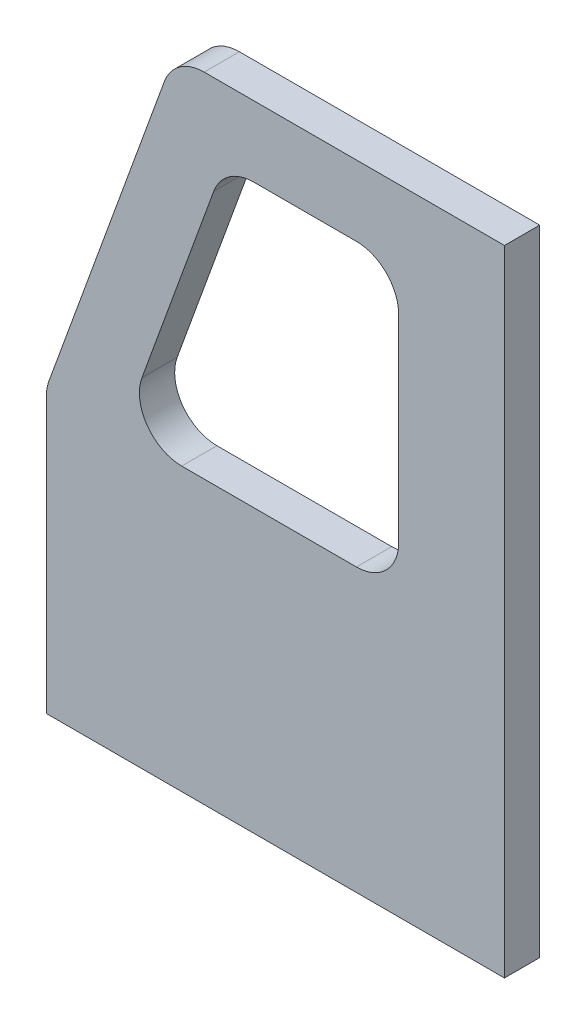
ISO-10303-21;
HEADER;
FILE_DESCRIPTION(('STEP AP214'),'2;1');
FILE_NAME('part.step','',(''),(''),'','','');
FILE_SCHEMA(('AUTOMOTIVE_DESIGN { 1 0 10303 214 1 1 1 1 }'));
ENDSEC;
DATA;
#1=APPLICATION_CONTEXT('core data for automotive mechanical design processes');
#2=APPLICATION_PROTOCOL_DEFINITION('international standard','automotive_design',2000,#1);
#3=PRODUCT_CONTEXT('',#1,'mechanical');
#4=PRODUCT('Part','Part','',(#3));
#5=PRODUCT_RELATED_PRODUCT_CATEGORY('part','',(#4));
#6=PRODUCT_DEFINITION_FORMATION('','',#4);
#7=PRODUCT_DEFINITION_CONTEXT('part definition',#1,'design');
#8=PRODUCT_DEFINITION('design','',#6,#7);
#9=PRODUCT_DEFINITION_SHAPE('','',#8);
#10=(LENGTH_UNIT() NAMED_UNIT(*) SI_UNIT(.MILLI.,.METRE.));
#11=(NAMED_UNIT(*) PLANE_ANGLE_UNIT() SI_UNIT($,.RADIAN.));
#12=(NAMED_UNIT(*) SI_UNIT($,.STERADIAN.) SOLID_ANGLE_UNIT());
#13=UNCERTAINTY_MEASURE_WITH_UNIT(LENGTH_MEASURE(1.E-05),#10,'distance_accuracy_value','');
#14=(GEOMETRIC_REPRESENTATION_CONTEXT(3) GLOBAL_UNCERTAINTY_ASSIGNED_CONTEXT((#13)) GLOBAL_UNIT_ASSIGNED_CONTEXT((#10,
#11,#12)) REPRESENTATION_CONTEXT('',''));
#15=CARTESIAN_POINT('',(0.,0.,0.));
#16=DIRECTION('',(0.,0.,1.));
#17=DIRECTION('',(1.,0.,0.));
#18=AXIS2_PLACEMENT_3D('',#15,#16,#17);
#19=CARTESIAN_POINT('',(0.,40.,5.));
#20=DIRECTION('',(1.,0.,0.));
#21=DIRECTION('',(0.,1.,0.));
#22=AXIS2_PLACEMENT_3D('',#19,#20,#21);
#23=PLANE('',#22);
#24=DIRECTION('',(0.,-1.,0.));
#25=VECTOR('',#24,1.);
#26=CARTESIAN_POINT('',(0.,40.,5.));
#27=LINE('',#26,#25);
#28=CARTESIAN_POINT('',(0.,38.9420381157492,5.));
#29=VERTEX_POINT('',#28);
#30=CARTESIAN_POINT('',(0.,0.,5.));
#31=VERTEX_POINT('',#30);
#32=EDGE_CURVE('E138',#29,#31,#27,.T.);
#33=ORIENTED_EDGE('',*,*,#32,.F.);
#34=DIRECTION('',(0.,0.,-1.));
#35=VECTOR('',#34,1.);
#36=CARTESIAN_POINT('',(0.,38.9420381157492,5.));
#37=LINE('',#36,#35);
#38=CARTESIAN_POINT('',(0.,38.9420381157492,0.));
#39=VERTEX_POINT('',#38);
#40=EDGE_CURVE('E181',#29,#39,#37,.T.);
#41=ORIENTED_EDGE('',*,*,#40,.T.);
#42=DIRECTION('',(0.,-1.,0.));
#43=VECTOR('',#42,1.);
#44=CARTESIAN_POINT('',(0.,40.,0.));
#45=LINE('',#44,#43);
#46=CARTESIAN_POINT('',(0.,0.,0.));
#47=VERTEX_POINT('',#46);
#48=EDGE_CURVE('E160',#39,#47,#45,.T.);
#49=ORIENTED_EDGE('',*,*,#48,.T.);
#50=DIRECTION('',(0.,0.,-1.));
#51=VECTOR('',#50,1.);
#52=CARTESIAN_POINT('',(0.,0.,5.));
#53=LINE('',#52,#51);
#54=EDGE_CURVE('E153',#31,#47,#53,.T.);
#55=ORIENTED_EDGE('',*,*,#54,.F.);
#56=EDGE_LOOP('',(#33,#41,#49,#55));
#57=FACE_BOUND('',#56,.T.);
#58=ADVANCED_FACE('F33',(#57),#23,.F.);
#59=CARTESIAN_POINT('',(0.,0.,5.));
#60=DIRECTION('',(0.,1.,0.));
#61=DIRECTION('',(0.,0.,1.));
#62=AXIS2_PLACEMENT_3D('',#59,#60,#61);
#63=PLANE('',#62);
#64=DIRECTION('',(1.,0.,0.));
#65=VECTOR('',#64,1.);
#66=CARTESIAN_POINT('',(0.,0.,0.));
#67=LINE('',#66,#65);
#68=CARTESIAN_POINT('',(65.,0.,0.));
#69=VERTEX_POINT('',#68);
#70=EDGE_CURVE('E261',#47,#69,#67,.T.);
#71=ORIENTED_EDGE('',*,*,#70,.T.);
#72=DIRECTION('',(0.,0.,-1.));
#73=VECTOR('',#72,1.);
#74=CARTESIAN_POINT('',(65.,0.,5.));
#75=LINE('',#74,#73);
#76=CARTESIAN_POINT('',(65.,0.,5.));
#77=VERTEX_POINT('',#76);
#78=EDGE_CURVE('E155',#77,#69,#75,.T.);
#79=ORIENTED_EDGE('',*,*,#78,.F.);
#80=DIRECTION('',(1.,0.,0.));
#81=VECTOR('',#80,1.);
#82=CARTESIAN_POINT('',(0.,0.,5.));
#83=LINE('',#82,#81);
#84=EDGE_CURVE('E142',#31,#77,#83,.T.);
#85=ORIENTED_EDGE('',*,*,#84,.F.);
#86=ORIENTED_EDGE('',*,*,#54,.T.);
#87=EDGE_LOOP('',(#71,#79,#85,#86));
#88=FACE_BOUND('',#87,.T.);
#89=ADVANCED_FACE('F152',(#88),#63,.F.);
#90=CARTESIAN_POINT('',(65.,0.,5.));
#91=DIRECTION('',(-1.,0.,0.));
#92=DIRECTION('',(0.,0.,1.));
#93=AXIS2_PLACEMENT_3D('',#90,#91,#92);
#94=PLANE('',#93);
#95=DIRECTION('',(0.,1.,0.));
#96=VECTOR('',#95,1.);
#97=CARTESIAN_POINT('',(65.,0.,0.));
#98=LINE('',#97,#96);
#99=CARTESIAN_POINT('',(65.,90.,0.));
#100=VERTEX_POINT('',#99);
#101=EDGE_CURVE('E263',#69,#100,#98,.T.);
#102=ORIENTED_EDGE('',*,*,#101,.T.);
#103=DIRECTION('',(0.,0.,-1.));
#104=VECTOR('',#103,1.);
#105=CARTESIAN_POINT('',(65.,90.,5.));
#106=LINE('',#105,#104);
#107=CARTESIAN_POINT('',(65.,90.,5.));
#108=VERTEX_POINT('',#107);
#109=EDGE_CURVE('E166',#108,#100,#106,.T.);
#110=ORIENTED_EDGE('',*,*,#109,.F.);
#111=DIRECTION('',(0.,1.,0.));
#112=VECTOR('',#111,1.);
#113=CARTESIAN_POINT('',(65.,0.,5.));
#114=LINE('',#113,#112);
#115=EDGE_CURVE('E157',#77,#108,#114,.T.);
#116=ORIENTED_EDGE('',*,*,#115,.F.);
#117=ORIENTED_EDGE('',*,*,#78,.T.);
#118=EDGE_LOOP('',(#102,#110,#116,#117));
#119=FACE_BOUND('',#118,.T.);
#120=ADVANCED_FACE('F289',(#119),#94,.F.);
#121=CARTESIAN_POINT('',(65.,90.,5.));
#122=DIRECTION('',(0.,-1.,0.));
#123=DIRECTION('',(0.,0.,-1.));
#124=AXIS2_PLACEMENT_3D('',#121,#122,#123);
#125=PLANE('',#124);
#126=DIRECTION('',(-1.,0.,0.));
#127=VECTOR('',#126,1.);
#128=CARTESIAN_POINT('',(65.,90.,0.));
#129=LINE('',#128,#127);
#130=CARTESIAN_POINT('',(22.3997569425684,90.,0.));
#131=VERTEX_POINT('',#130);
#132=EDGE_CURVE('E265',#100,#131,#129,.T.);
#133=ORIENTED_EDGE('',*,*,#132,.T.);
#134=DIRECTION('',(0.,0.,-1.));
#135=VECTOR('',#134,1.);
#136=CARTESIAN_POINT('',(22.3997569425684,90.,5.));
#137=LINE('',#136,#135);
#138=CARTESIAN_POINT('',(22.3997569425684,90.,5.));
#139=VERTEX_POINT('',#138);
#140=EDGE_CURVE('E176',#131,#139,#137,.F.);
#141=ORIENTED_EDGE('',*,*,#140,.T.);
#142=DIRECTION('',(-1.,0.,0.));
#143=VECTOR('',#142,1.);
#144=CARTESIAN_POINT('',(65.,90.,5.));
#145=LINE('',#144,#143);
#146=EDGE_CURVE('E256',#108,#139,#145,.T.);
#147=ORIENTED_EDGE('',*,*,#146,.F.);
#148=ORIENTED_EDGE('',*,*,#109,.T.);
#149=EDGE_LOOP('',(#133,#141,#147,#148));
#150=FACE_BOUND('',#149,.T.);
#151=ADVANCED_FACE('F274',(#150),#125,.F.);
#152=CARTESIAN_POINT('',(18.1985117133102,90.,5.));
#153=DIRECTION('',(0.939692620785908,-0.34202014332567,0.));
#154=DIRECTION('',(0.34202014332567,0.939692620785908,0.));
#155=AXIS2_PLACEMENT_3D('',#152,#153,#154);
#156=PLANE('',#155);
#157=DIRECTION('',(-0.34202014332567,-0.939692620785908,0.));
#158=VECTOR('',#157,1.);
#159=CARTESIAN_POINT('',(18.1985117133102,90.,5.));
#160=LINE('',#159,#158);
#161=CARTESIAN_POINT('',(16.761601217853,86.052120859954,5.));
#162=VERTEX_POINT('',#161);
#163=CARTESIAN_POINT('',(0.361844275284552,40.9941589757032,5.));
#164=VERTEX_POINT('',#163);
#165=EDGE_CURVE('E258',#162,#164,#160,.T.);
#166=ORIENTED_EDGE('',*,*,#165,.F.);
#167=DIRECTION('',(0.,0.,-1.));
#168=VECTOR('',#167,1.);
#169=CARTESIAN_POINT('',(16.761601217853,86.052120859954,5.));
#170=LINE('',#169,#168);
#171=CARTESIAN_POINT('',(16.761601217853,86.052120859954,0.));
#172=VERTEX_POINT('',#171);
#173=EDGE_CURVE('E164',#162,#172,#170,.T.);
#174=ORIENTED_EDGE('',*,*,#173,.T.);
#175=DIRECTION('',(-0.34202014332567,-0.939692620785908,0.));
#176=VECTOR('',#175,1.);
#177=CARTESIAN_POINT('',(18.1985117133102,90.,0.));
#178=LINE('',#177,#176);
#179=CARTESIAN_POINT('',(0.361844275284552,40.9941589757032,0.));
#180=VERTEX_POINT('',#179);
#181=EDGE_CURVE('E148',#172,#180,#178,.T.);
#182=ORIENTED_EDGE('',*,*,#181,.T.);
#183=DIRECTION('',(0.,0.,-1.));
#184=VECTOR('',#183,1.);
#185=CARTESIAN_POINT('',(0.361844275284552,40.9941589757032,5.));
#186=LINE('',#185,#184);
#187=EDGE_CURVE('E162',#180,#164,#186,.F.);
#188=ORIENTED_EDGE('',*,*,#187,.T.);
#189=EDGE_LOOP('',(#166,#174,#182,#188));
#190=FACE_BOUND('',#189,.T.);
#191=ADVANCED_FACE('F285',(#190),#156,.F.);
#192=CARTESIAN_POINT('',(0.,0.,5.));
#193=DIRECTION('',(0.,0.,1.));
#194=DIRECTION('',(1.,0.,0.));
#195=AXIS2_PLACEMENT_3D('',#192,#193,#194);
#196=PLANE('',#195);
#197=DIRECTION('',(1.,0.,0.));
#198=VECTOR('',#197,1.);
#199=CARTESIAN_POINT('',(0.,40.,5.));
#200=LINE('',#199,#198);
#201=CARTESIAN_POINT('',(19.2106657652118,40.,5.));
#202=VERTEX_POINT('',#201);
#203=CARTESIAN_POINT('',(44.,40.,5.));
#204=VERTEX_POINT('',#203);
#205=EDGE_CURVE('E218',#202,#204,#200,.T.);
#206=ORIENTED_EDGE('',*,*,#205,.F.);
#207=CARTESIAN_POINT('',(19.2106657652118,46.,5.));
#208=DIRECTION('',(0.,0.,1.));
#209=DIRECTION('',(1.,0.,0.));
#210=AXIS2_PLACEMENT_3D('',#207,#208,#209);
#211=CIRCLE('',#210,6.);
#212=CARTESIAN_POINT('',(13.5725100404964,48.052120859954,5.));
#213=VERTEX_POINT('',#212);
#214=EDGE_CURVE('E41',#202,#213,#211,.F.);
#215=ORIENTED_EDGE('',*,*,#214,.T.);
#216=DIRECTION('',(-0.34202014332567,-0.939692620785908,0.));
#217=VECTOR('',#216,1.);
#218=CARTESIAN_POINT('',(-3.45882598587175,1.25890970436377,5.));
#219=LINE('',#218,#217);
#220=CARTESIAN_POINT('',(23.7636765999501,76.052120859954,5.));
#221=VERTEX_POINT('',#220);
#222=EDGE_CURVE('E216',#221,#213,#219,.T.);
#223=ORIENTED_EDGE('',*,*,#222,.F.);
#224=CARTESIAN_POINT('',(29.4018323246655,74.,5.));
#225=DIRECTION('',(0.,0.,1.));
#226=DIRECTION('',(1.,0.,0.));
#227=AXIS2_PLACEMENT_3D('',#224,#225,#226);
#228=CIRCLE('',#227,6.);
#229=CARTESIAN_POINT('',(29.4018323246655,80.,5.));
#230=VERTEX_POINT('',#229);
#231=EDGE_CURVE('E203',#221,#230,#228,.F.);
#232=ORIENTED_EDGE('',*,*,#231,.T.);
#233=DIRECTION('',(-1.,0.,0.));
#234=VECTOR('',#233,1.);
#235=CARTESIAN_POINT('',(0.,80.,5.));
#236=LINE('',#235,#234);
#237=CARTESIAN_POINT('',(44.,80.,5.));
#238=VERTEX_POINT('',#237);
#239=EDGE_CURVE('E227',#238,#230,#236,.T.);
#240=ORIENTED_EDGE('',*,*,#239,.F.);
#241=CARTESIAN_POINT('',(44.,74.,5.));
#242=DIRECTION('',(0.,0.,1.));
#243=DIRECTION('',(1.,0.,0.));
#244=AXIS2_PLACEMENT_3D('',#241,#242,#243);
#245=CIRCLE('',#244,6.);
#246=CARTESIAN_POINT('',(50.,74.,5.));
#247=VERTEX_POINT('',#246);
#248=EDGE_CURVE('E56',#238,#247,#245,.F.);
#249=ORIENTED_EDGE('',*,*,#248,.T.);
#250=DIRECTION('',(0.,1.,0.));
#251=VECTOR('',#250,1.);
#252=CARTESIAN_POINT('',(50.,0.,5.));
#253=LINE('',#252,#251);
#254=CARTESIAN_POINT('',(50.,46.,5.));
#255=VERTEX_POINT('',#254);
#256=EDGE_CURVE('E250',#255,#247,#253,.T.);
#257=ORIENTED_EDGE('',*,*,#256,.F.);
#258=CARTESIAN_POINT('',(44.,46.,5.));
#259=DIRECTION('',(0.,0.,1.));
#260=DIRECTION('',(1.,0.,0.));
#261=AXIS2_PLACEMENT_3D('',#258,#259,#260);
#262=CIRCLE('',#261,6.);
#263=EDGE_CURVE('E210',#255,#204,#262,.F.);
#264=ORIENTED_EDGE('',*,*,#263,.T.);
#265=EDGE_LOOP('',(#206,#215,#223,#232,#240,#249,#257,#264));
#266=FACE_BOUND('',#265,.T.);
#267=ORIENTED_EDGE('',*,*,#146,.T.);
#268=CARTESIAN_POINT('',(22.3997569425684,84.,5.));
#269=DIRECTION('',(0.,0.,1.));
#270=DIRECTION('',(1.,0.,0.));
#271=AXIS2_PLACEMENT_3D('',#268,#269,#270);
#272=CIRCLE('',#271,6.);
#273=EDGE_CURVE('E179',#139,#162,#272,.T.);
#274=ORIENTED_EDGE('',*,*,#273,.T.);
#275=ORIENTED_EDGE('',*,*,#165,.T.);
#276=CARTESIAN_POINT('',(6.,38.9420381157492,5.));
#277=DIRECTION('',(0.,0.,1.));
#278=DIRECTION('',(1.,0.,0.));
#279=AXIS2_PLACEMENT_3D('',#276,#277,#278);
#280=CIRCLE('',#279,6.);
#281=EDGE_CURVE('E48',#164,#29,#280,.T.);
#282=ORIENTED_EDGE('',*,*,#281,.T.);
#283=ORIENTED_EDGE('',*,*,#32,.T.);
#284=ORIENTED_EDGE('',*,*,#84,.T.);
#285=ORIENTED_EDGE('',*,*,#115,.T.);
#286=EDGE_LOOP('',(#267,#274,#275,#282,#283,#284,#285));
#287=FACE_BOUND('',#286,.T.);
#288=ADVANCED_FACE('F141',(#266,#287),#196,.T.);
#289=CARTESIAN_POINT('',(0.,0.,0.));
#290=DIRECTION('',(0.,0.,1.));
#291=DIRECTION('',(1.,0.,0.));
#292=AXIS2_PLACEMENT_3D('',#289,#290,#291);
#293=PLANE('',#292);
#294=DIRECTION('',(-1.,0.,0.));
#295=VECTOR('',#294,1.);
#296=CARTESIAN_POINT('',(25.2005870954072,80.,0.));
#297=LINE('',#296,#295);
#298=CARTESIAN_POINT('',(44.,80.,0.));
#299=VERTEX_POINT('',#298);
#300=CARTESIAN_POINT('',(29.4018323246655,80.,0.));
#301=VERTEX_POINT('',#300);
#302=EDGE_CURVE('E245',#299,#301,#297,.T.);
#303=ORIENTED_EDGE('',*,*,#302,.T.);
#304=CARTESIAN_POINT('',(29.4018323246655,74.,0.));
#305=DIRECTION('',(0.,0.,1.));
#306=DIRECTION('',(1.,0.,0.));
#307=AXIS2_PLACEMENT_3D('',#304,#305,#306);
#308=CIRCLE('',#307,6.);
#309=CARTESIAN_POINT('',(23.76367659995,76.052120859954,0.));
#310=VERTEX_POINT('',#309);
#311=EDGE_CURVE('E205',#301,#310,#308,.T.);
#312=ORIENTED_EDGE('',*,*,#311,.T.);
#313=DIRECTION('',(-0.34202014332567,-0.939692620785908,0.));
#314=VECTOR('',#313,1.);
#315=CARTESIAN_POINT('',(10.6417777247591,40.,0.));
#316=LINE('',#315,#314);
#317=CARTESIAN_POINT('',(13.5725100404964,48.052120859954,0.));
#318=VERTEX_POINT('',#317);
#319=EDGE_CURVE('E238',#310,#318,#316,.T.);
#320=ORIENTED_EDGE('',*,*,#319,.T.);
#321=CARTESIAN_POINT('',(19.2106657652118,46.,0.));
#322=DIRECTION('',(0.,0.,1.));
#323=DIRECTION('',(1.,0.,0.));
#324=AXIS2_PLACEMENT_3D('',#321,#322,#323);
#325=CIRCLE('',#324,6.);
#326=CARTESIAN_POINT('',(19.2106657652118,40.,0.));
#327=VERTEX_POINT('',#326);
#328=EDGE_CURVE('E11',#318,#327,#325,.T.);
#329=ORIENTED_EDGE('',*,*,#328,.T.);
#330=DIRECTION('',(1.,0.,0.));
#331=VECTOR('',#330,1.);
#332=CARTESIAN_POINT('',(50.,40.,0.));
#333=LINE('',#332,#331);
#334=CARTESIAN_POINT('',(44.,40.,0.));
#335=VERTEX_POINT('',#334);
#336=EDGE_CURVE('E236',#327,#335,#333,.T.);
#337=ORIENTED_EDGE('',*,*,#336,.T.);
#338=CARTESIAN_POINT('',(44.,46.,0.));
#339=DIRECTION('',(0.,0.,1.));
#340=DIRECTION('',(1.,0.,0.));
#341=AXIS2_PLACEMENT_3D('',#338,#339,#340);
#342=CIRCLE('',#341,6.);
#343=CARTESIAN_POINT('',(50.,46.,0.));
#344=VERTEX_POINT('',#343);
#345=EDGE_CURVE('E212',#335,#344,#342,.T.);
#346=ORIENTED_EDGE('',*,*,#345,.T.);
#347=DIRECTION('',(0.,1.,0.));
#348=VECTOR('',#347,1.);
#349=CARTESIAN_POINT('',(50.,80.,0.));
#350=LINE('',#349,#348);
#351=CARTESIAN_POINT('',(50.,74.,0.));
#352=VERTEX_POINT('',#351);
#353=EDGE_CURVE('E242',#344,#352,#350,.T.);
#354=ORIENTED_EDGE('',*,*,#353,.T.);
#355=CARTESIAN_POINT('',(44.,74.,0.));
#356=DIRECTION('',(0.,0.,1.));
#357=DIRECTION('',(1.,0.,0.));
#358=AXIS2_PLACEMENT_3D('',#355,#356,#357);
#359=CIRCLE('',#358,6.);
#360=EDGE_CURVE('E208',#352,#299,#359,.T.);
#361=ORIENTED_EDGE('',*,*,#360,.T.);
#362=EDGE_LOOP('',(#303,#312,#320,#329,#337,#346,#354,#361));
#363=FACE_BOUND('',#362,.T.);
#364=ORIENTED_EDGE('',*,*,#181,.F.);
#365=CARTESIAN_POINT('',(22.3997569425684,84.,0.));
#366=DIRECTION('',(0.,0.,1.));
#367=DIRECTION('',(1.,0.,0.));
#368=AXIS2_PLACEMENT_3D('',#365,#366,#367);
#369=CIRCLE('',#368,6.);
#370=EDGE_CURVE('E174',#172,#131,#369,.F.);
#371=ORIENTED_EDGE('',*,*,#370,.T.);
#372=ORIENTED_EDGE('',*,*,#132,.F.);
#373=ORIENTED_EDGE('',*,*,#101,.F.);
#374=ORIENTED_EDGE('',*,*,#70,.F.);
#375=ORIENTED_EDGE('',*,*,#48,.F.);
#376=CARTESIAN_POINT('',(6.,38.9420381157492,0.));
#377=DIRECTION('',(0.,0.,1.));
#378=DIRECTION('',(1.,0.,0.));
#379=AXIS2_PLACEMENT_3D('',#376,#377,#378);
#380=CIRCLE('',#379,6.);
#381=EDGE_CURVE('E172',#39,#180,#380,.F.);
#382=ORIENTED_EDGE('',*,*,#381,.T.);
#383=EDGE_LOOP('',(#364,#371,#372,#373,#374,#375,#382));
#384=FACE_BOUND('',#383,.T.);
#385=ADVANCED_FACE('F234',(#363,#384),#293,.F.);
#386=CARTESIAN_POINT('',(50.,40.,0.));
#387=DIRECTION('',(0.,-1.,0.));
#388=DIRECTION('',(1.,0.,0.));
#389=AXIS2_PLACEMENT_3D('',#386,#387,#388);
#390=PLANE('',#389);
#391=ORIENTED_EDGE('',*,*,#205,.T.);
#392=DIRECTION('',(0.,0.,1.));
#393=VECTOR('',#392,1.);
#394=CARTESIAN_POINT('',(44.,40.,0.));
#395=LINE('',#394,#393);
#396=EDGE_CURVE('E201',#204,#335,#395,.F.);
#397=ORIENTED_EDGE('',*,*,#396,.T.);
#398=ORIENTED_EDGE('',*,*,#336,.F.);
#399=DIRECTION('',(0.,0.,1.));
#400=VECTOR('',#399,1.);
#401=CARTESIAN_POINT('',(19.2106657652118,40.,5.));
#402=LINE('',#401,#400);
#403=EDGE_CURVE('E198',#327,#202,#402,.T.);
#404=ORIENTED_EDGE('',*,*,#403,.T.);
#405=EDGE_LOOP('',(#391,#397,#398,#404));
#406=FACE_BOUND('',#405,.T.);
#407=ADVANCED_FACE('F240',(#406),#390,.F.);
#408=CARTESIAN_POINT('',(10.6417777247591,40.,0.));
#409=DIRECTION('',(-0.939692620785908,0.34202014332567,0.));
#410=DIRECTION('',(-0.34202014332567,-0.939692620785908,0.));
#411=AXIS2_PLACEMENT_3D('',#408,#409,#410);
#412=PLANE('',#411);
#413=ORIENTED_EDGE('',*,*,#319,.F.);
#414=DIRECTION('',(0.,0.,1.));
#415=VECTOR('',#414,1.);
#416=CARTESIAN_POINT('',(23.7636765999501,76.052120859954,5.));
#417=LINE('',#416,#415);
#418=EDGE_CURVE('E185',#310,#221,#417,.T.);
#419=ORIENTED_EDGE('',*,*,#418,.T.);
#420=ORIENTED_EDGE('',*,*,#222,.T.);
#421=DIRECTION('',(0.,0.,1.));
#422=VECTOR('',#421,1.);
#423=CARTESIAN_POINT('',(13.5725100404964,48.052120859954,0.));
#424=LINE('',#423,#422);
#425=EDGE_CURVE('E183',#213,#318,#424,.F.);
#426=ORIENTED_EDGE('',*,*,#425,.T.);
#427=EDGE_LOOP('',(#413,#419,#420,#426));
#428=FACE_BOUND('',#427,.T.);
#429=ADVANCED_FACE('F224',(#428),#412,.F.);
#430=CARTESIAN_POINT('',(25.2005870954072,80.,0.));
#431=DIRECTION('',(0.,1.,0.));
#432=DIRECTION('',(0.,0.,1.));
#433=AXIS2_PLACEMENT_3D('',#430,#431,#432);
#434=PLANE('',#433);
#435=ORIENTED_EDGE('',*,*,#239,.T.);
#436=DIRECTION('',(0.,0.,1.));
#437=VECTOR('',#436,1.);
#438=CARTESIAN_POINT('',(29.4018323246655,80.,0.));
#439=LINE('',#438,#437);
#440=EDGE_CURVE('E191',#230,#301,#439,.F.);
#441=ORIENTED_EDGE('',*,*,#440,.T.);
#442=ORIENTED_EDGE('',*,*,#302,.F.);
#443=DIRECTION('',(0.,0.,1.));
#444=VECTOR('',#443,1.);
#445=CARTESIAN_POINT('',(44.,80.,5.));
#446=LINE('',#445,#444);
#447=EDGE_CURVE('E188',#299,#238,#446,.T.);
#448=ORIENTED_EDGE('',*,*,#447,.T.);
#449=EDGE_LOOP('',(#435,#441,#442,#448));
#450=FACE_BOUND('',#449,.T.);
#451=ADVANCED_FACE('F330',(#450),#434,.F.);
#452=CARTESIAN_POINT('',(50.,80.,0.));
#453=DIRECTION('',(1.,0.,0.));
#454=DIRECTION('',(0.,1.,0.));
#455=AXIS2_PLACEMENT_3D('',#452,#453,#454);
#456=PLANE('',#455);
#457=ORIENTED_EDGE('',*,*,#256,.T.);
#458=DIRECTION('',(0.,0.,1.));
#459=VECTOR('',#458,1.);
#460=CARTESIAN_POINT('',(50.,74.,0.));
#461=LINE('',#460,#459);
#462=EDGE_CURVE('E196',#247,#352,#461,.F.);
#463=ORIENTED_EDGE('',*,*,#462,.T.);
#464=ORIENTED_EDGE('',*,*,#353,.F.);
#465=DIRECTION('',(0.,0.,1.));
#466=VECTOR('',#465,1.);
#467=CARTESIAN_POINT('',(50.,46.,5.));
#468=LINE('',#467,#466);
#469=EDGE_CURVE('E193',#344,#255,#468,.T.);
#470=ORIENTED_EDGE('',*,*,#469,.T.);
#471=EDGE_LOOP('',(#457,#463,#464,#470));
#472=FACE_BOUND('',#471,.T.);
#473=ADVANCED_FACE('F305',(#472),#456,.F.);
#474=CARTESIAN_POINT('',(22.3997569425684,84.,5.));
#475=DIRECTION('',(0.,0.,-1.));
#476=DIRECTION('',(-1.,0.,0.));
#477=AXIS2_PLACEMENT_3D('',#474,#475,#476);
#478=CYLINDRICAL_SURFACE('',#477,6.);
#479=ORIENTED_EDGE('',*,*,#273,.F.);
#480=ORIENTED_EDGE('',*,*,#140,.F.);
#481=ORIENTED_EDGE('',*,*,#370,.F.);
#482=ORIENTED_EDGE('',*,*,#173,.F.);
#483=EDGE_LOOP('',(#479,#480,#481,#482));
#484=FACE_BOUND('',#483,.T.);
#485=ADVANCED_FACE('F282',(#484),#478,.T.);
#486=CARTESIAN_POINT('',(6.,38.9420381157492,5.));
#487=DIRECTION('',(0.,0.,-1.));
#488=DIRECTION('',(-1.,0.,0.));
#489=AXIS2_PLACEMENT_3D('',#486,#487,#488);
#490=CYLINDRICAL_SURFACE('',#489,6.);
#491=ORIENTED_EDGE('',*,*,#281,.F.);
#492=ORIENTED_EDGE('',*,*,#187,.F.);
#493=ORIENTED_EDGE('',*,*,#381,.F.);
#494=ORIENTED_EDGE('',*,*,#40,.F.);
#495=EDGE_LOOP('',(#491,#492,#493,#494));
#496=FACE_BOUND('',#495,.T.);
#497=ADVANCED_FACE('F288',(#496),#490,.T.);
#498=CARTESIAN_POINT('',(29.4018323246655,74.,0.));
#499=DIRECTION('',(0.,0.,-1.));
#500=DIRECTION('',(-1.,0.,0.));
#501=AXIS2_PLACEMENT_3D('',#498,#499,#500);
#502=CYLINDRICAL_SURFACE('',#501,6.);
#503=ORIENTED_EDGE('',*,*,#311,.F.);
#504=ORIENTED_EDGE('',*,*,#440,.F.);
#505=ORIENTED_EDGE('',*,*,#231,.F.);
#506=ORIENTED_EDGE('',*,*,#418,.F.);
#507=EDGE_LOOP('',(#503,#504,#505,#506));
#508=FACE_BOUND('',#507,.T.);
#509=ADVANCED_FACE('F308',(#508),#502,.F.);
#510=CARTESIAN_POINT('',(44.,74.,0.));
#511=DIRECTION('',(0.,0.,-1.));
#512=DIRECTION('',(-1.,0.,0.));
#513=AXIS2_PLACEMENT_3D('',#510,#511,#512);
#514=CYLINDRICAL_SURFACE('',#513,6.);
#515=ORIENTED_EDGE('',*,*,#360,.F.);
#516=ORIENTED_EDGE('',*,*,#462,.F.);
#517=ORIENTED_EDGE('',*,*,#248,.F.);
#518=ORIENTED_EDGE('',*,*,#447,.F.);
#519=EDGE_LOOP('',(#515,#516,#517,#518));
#520=FACE_BOUND('',#519,.T.);
#521=ADVANCED_FACE('F311',(#520),#514,.F.);
#522=CARTESIAN_POINT('',(44.,46.,0.));
#523=DIRECTION('',(0.,0.,-1.));
#524=DIRECTION('',(-1.,0.,0.));
#525=AXIS2_PLACEMENT_3D('',#522,#523,#524);
#526=CYLINDRICAL_SURFACE('',#525,6.);
#527=ORIENTED_EDGE('',*,*,#345,.F.);
#528=ORIENTED_EDGE('',*,*,#396,.F.);
#529=ORIENTED_EDGE('',*,*,#263,.F.);
#530=ORIENTED_EDGE('',*,*,#469,.F.);
#531=EDGE_LOOP('',(#527,#528,#529,#530));
#532=FACE_BOUND('',#531,.T.);
#533=ADVANCED_FACE('F314',(#532),#526,.F.);
#534=CARTESIAN_POINT('',(19.2106657652118,46.,0.));
#535=DIRECTION('',(0.,0.,-1.));
#536=DIRECTION('',(-1.,0.,0.));
#537=AXIS2_PLACEMENT_3D('',#534,#535,#536);
#538=CYLINDRICAL_SURFACE('',#537,6.);
#539=ORIENTED_EDGE('',*,*,#328,.F.);
#540=ORIENTED_EDGE('',*,*,#425,.F.);
#541=ORIENTED_EDGE('',*,*,#214,.F.);
#542=ORIENTED_EDGE('',*,*,#403,.F.);
#543=EDGE_LOOP('',(#539,#540,#541,#542));
#544=FACE_BOUND('',#543,.T.);
#545=ADVANCED_FACE('F35',(#544),#538,.F.);
#546=CLOSED_SHELL('',(#58,#89,#120,#151,#191,#288,#385,#407,#429,#451,#473,#485,#497,#509,#521,
#533,#545));
#547=MANIFOLD_SOLID_BREP('B2',#546);
#548=ADVANCED_BREP_SHAPE_REPRESENTATION('',(#18,#547),#14);
#549=SHAPE_DEFINITION_REPRESENTATION(#9,#548);
ENDSEC;
END-ISO-10303-21;
